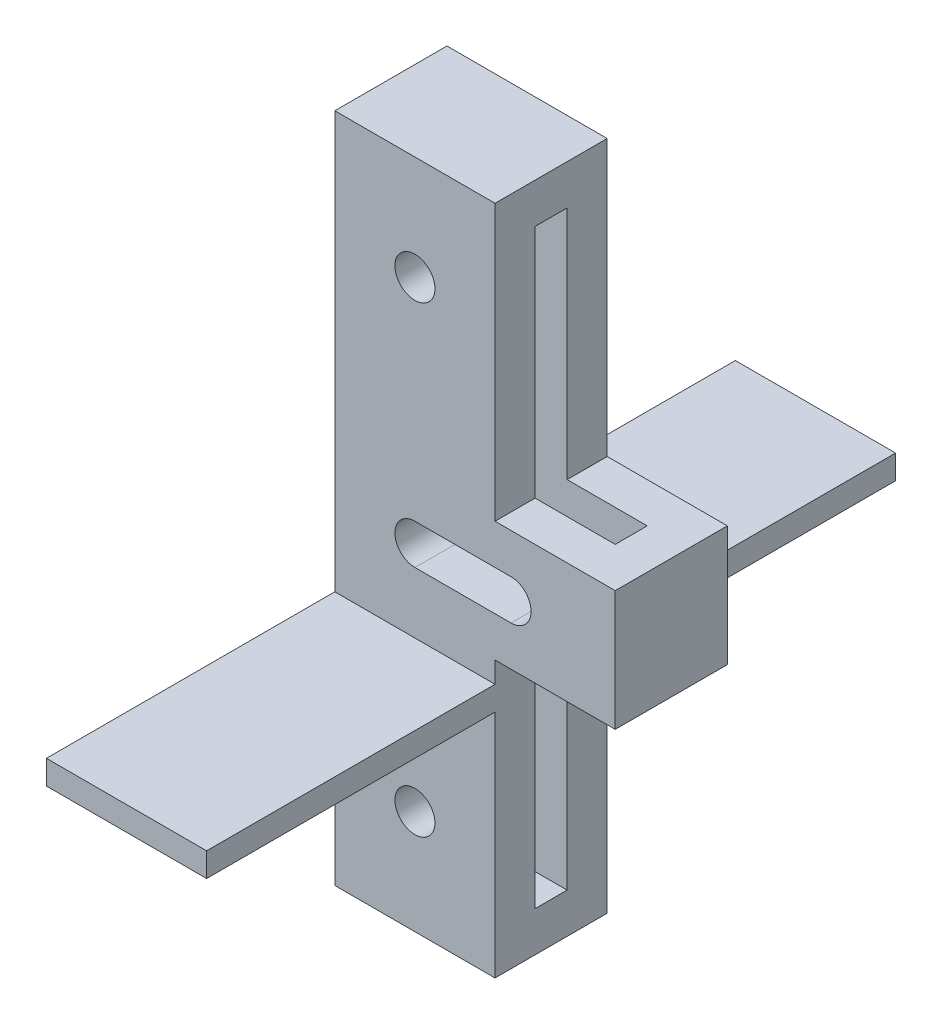
ISO-10303-21;
HEADER;
FILE_DESCRIPTION(('STEP AP214'),'2;1');
FILE_NAME('part.step','',(''),(''),'','','');
FILE_SCHEMA(('AUTOMOTIVE_DESIGN { 1 0 10303 214 1 1 1 1 }'));
ENDSEC;
DATA;
#1=APPLICATION_CONTEXT('core data for automotive mechanical design processes');
#2=APPLICATION_PROTOCOL_DEFINITION('international standard','automotive_design',2000,#1);
#3=PRODUCT_CONTEXT('',#1,'mechanical');
#4=PRODUCT('Part','Part','',(#3));
#5=PRODUCT_RELATED_PRODUCT_CATEGORY('part','',(#4));
#6=PRODUCT_DEFINITION_FORMATION('','',#4);
#7=PRODUCT_DEFINITION_CONTEXT('part definition',#1,'design');
#8=PRODUCT_DEFINITION('design','',#6,#7);
#9=PRODUCT_DEFINITION_SHAPE('','',#8);
#10=(LENGTH_UNIT() NAMED_UNIT(*) SI_UNIT(.MILLI.,.METRE.));
#11=(NAMED_UNIT(*) PLANE_ANGLE_UNIT() SI_UNIT($,.RADIAN.));
#12=(NAMED_UNIT(*) SI_UNIT($,.STERADIAN.) SOLID_ANGLE_UNIT());
#13=UNCERTAINTY_MEASURE_WITH_UNIT(LENGTH_MEASURE(1.E-05),#10,'distance_accuracy_value','');
#14=(GEOMETRIC_REPRESENTATION_CONTEXT(3) GLOBAL_UNCERTAINTY_ASSIGNED_CONTEXT((#13)) GLOBAL_UNIT_ASSIGNED_CONTEXT((#10,
#11,#12)) REPRESENTATION_CONTEXT('',''));
#15=CARTESIAN_POINT('',(0.,0.,0.));
#16=DIRECTION('',(0.,0.,1.));
#17=DIRECTION('',(1.,0.,0.));
#18=AXIS2_PLACEMENT_3D('',#15,#16,#17);
#19=CARTESIAN_POINT('',(-10.,0.,6.99999999999999));
#20=DIRECTION('',(0.,0.,-1.));
#21=DIRECTION('',(-1.,0.,0.));
#22=AXIS2_PLACEMENT_3D('',#19,#20,#21);
#23=PLANE('',#22);
#24=CARTESIAN_POINT('',(0.,-28.875,6.99999999999999));
#25=DIRECTION('',(0.,0.,-1.));
#26=DIRECTION('',(-1.,0.,0.));
#27=AXIS2_PLACEMENT_3D('',#24,#25,#26);
#28=CIRCLE('',#27,2.5);
#29=CARTESIAN_POINT('',(-2.5,-28.875,6.99999999999999));
#30=VERTEX_POINT('',#29);
#31=EDGE_CURVE('E328',#30,#30,#28,.T.);
#32=ORIENTED_EDGE('',*,*,#31,.T.);
#33=EDGE_LOOP('',(#32));
#34=FACE_BOUND('',#33,.T.);
#35=DIRECTION('',(1.,0.,0.));
#36=VECTOR('',#35,1.);
#37=CARTESIAN_POINT('',(-10.,-13.125,6.99999999999999));
#38=LINE('',#37,#36);
#39=CARTESIAN_POINT('',(-10.,-13.125,6.99999999999999));
#40=VERTEX_POINT('',#39);
#41=CARTESIAN_POINT('',(10.,-13.125,6.99999999999999));
#42=VERTEX_POINT('',#41);
#43=EDGE_CURVE('E314',#40,#42,#38,.T.);
#44=ORIENTED_EDGE('',*,*,#43,.F.);
#45=DIRECTION('',(0.,1.,0.));
#46=VECTOR('',#45,1.);
#47=CARTESIAN_POINT('',(-10.,0.,6.99999999999999));
#48=LINE('',#47,#46);
#49=CARTESIAN_POINT('',(-10.,-41.875,6.99999999999999));
#50=VERTEX_POINT('',#49);
#51=EDGE_CURVE('E678',#50,#40,#48,.T.);
#52=ORIENTED_EDGE('',*,*,#51,.F.);
#53=DIRECTION('',(1.,0.,0.));
#54=VECTOR('',#53,1.);
#55=CARTESIAN_POINT('',(-10.,-41.875,6.99999999999999));
#56=LINE('',#55,#54);
#57=CARTESIAN_POINT('',(10.,-41.875,6.99999999999999));
#58=VERTEX_POINT('',#57);
#59=EDGE_CURVE('E706',#50,#58,#56,.T.);
#60=ORIENTED_EDGE('',*,*,#59,.T.);
#61=DIRECTION('',(0.,1.,0.));
#62=VECTOR('',#61,1.);
#63=CARTESIAN_POINT('',(10.,0.,6.99999999999999));
#64=LINE('',#63,#62);
#65=EDGE_CURVE('E662',#58,#42,#64,.T.);
#66=ORIENTED_EDGE('',*,*,#65,.T.);
#67=EDGE_LOOP('',(#44,#52,#60,#66));
#68=FACE_BOUND('',#67,.T.);
#69=ADVANCED_FACE('F39',(#34,#68),#23,.F.);
#70=CARTESIAN_POINT('',(-10.,0.,-7.));
#71=DIRECTION('',(0.,0.,-1.));
#72=DIRECTION('',(0.,1.,0.));
#73=AXIS2_PLACEMENT_3D('',#70,#71,#72);
#74=PLANE('',#73);
#75=CARTESIAN_POINT('',(0.,-28.875,-7.00000000000001));
#76=DIRECTION('',(0.,0.,-1.));
#77=DIRECTION('',(0.,1.,0.));
#78=AXIS2_PLACEMENT_3D('',#75,#76,#77);
#79=CIRCLE('',#78,2.5);
#80=CARTESIAN_POINT('',(0.,-26.375,-7.00000000000001));
#81=VERTEX_POINT('',#80);
#82=EDGE_CURVE('E335',#81,#81,#79,.T.);
#83=ORIENTED_EDGE('',*,*,#82,.F.);
#84=EDGE_LOOP('',(#83));
#85=FACE_BOUND('',#84,.T.);
#86=DIRECTION('',(0.,1.,0.));
#87=VECTOR('',#86,1.);
#88=CARTESIAN_POINT('',(-10.,0.,-7.));
#89=LINE('',#88,#87);
#90=CARTESIAN_POINT('',(-10.,-41.875,-7.00000000000001));
#91=VERTEX_POINT('',#90);
#92=CARTESIAN_POINT('',(-10.,-13.125,-7.));
#93=VERTEX_POINT('',#92);
#94=EDGE_CURVE('E571',#91,#93,#89,.T.);
#95=ORIENTED_EDGE('',*,*,#94,.T.);
#96=DIRECTION('',(1.,0.,0.));
#97=VECTOR('',#96,1.);
#98=CARTESIAN_POINT('',(-10.,-13.125,-7.));
#99=LINE('',#98,#97);
#100=CARTESIAN_POINT('',(10.,-13.125,-7.));
#101=VERTEX_POINT('',#100);
#102=EDGE_CURVE('E575',#93,#101,#99,.T.);
#103=ORIENTED_EDGE('',*,*,#102,.T.);
#104=DIRECTION('',(0.,1.,0.));
#105=VECTOR('',#104,1.);
#106=CARTESIAN_POINT('',(10.,0.,-7.));
#107=LINE('',#106,#105);
#108=CARTESIAN_POINT('',(10.,-41.875,-7.00000000000001));
#109=VERTEX_POINT('',#108);
#110=EDGE_CURVE('E692',#109,#101,#107,.T.);
#111=ORIENTED_EDGE('',*,*,#110,.F.);
#112=DIRECTION('',(1.,0.,0.));
#113=VECTOR('',#112,1.);
#114=CARTESIAN_POINT('',(-10.,-41.875,-7.00000000000001));
#115=LINE('',#114,#113);
#116=EDGE_CURVE('E577',#91,#109,#115,.T.);
#117=ORIENTED_EDGE('',*,*,#116,.F.);
#118=EDGE_LOOP('',(#95,#103,#111,#117));
#119=FACE_BOUND('',#118,.T.);
#120=ADVANCED_FACE('F391',(#85,#119),#74,.T.);
#121=CARTESIAN_POINT('',(-10.,0.,1.99999999999999));
#122=DIRECTION('',(0.,0.,1.));
#123=DIRECTION('',(0.,-1.,0.));
#124=AXIS2_PLACEMENT_3D('',#121,#122,#123);
#125=PLANE('',#124);
#126=CARTESIAN_POINT('',(0.,-28.875,1.99999999999998));
#127=DIRECTION('',(0.,0.,1.));
#128=DIRECTION('',(0.,-1.,0.));
#129=AXIS2_PLACEMENT_3D('',#126,#127,#128);
#130=CIRCLE('',#129,2.5);
#131=CARTESIAN_POINT('',(0.,-31.375,1.99999999999998));
#132=VERTEX_POINT('',#131);
#133=EDGE_CURVE('E340',#132,#132,#130,.T.);
#134=ORIENTED_EDGE('',*,*,#133,.T.);
#135=EDGE_LOOP('',(#134));
#136=FACE_BOUND('',#135,.T.);
#137=CARTESIAN_POINT('',(0.,28.875,1.99999999999999));
#138=DIRECTION('',(0.,0.,1.));
#139=DIRECTION('',(0.,-1.,0.));
#140=AXIS2_PLACEMENT_3D('',#137,#138,#139);
#141=CIRCLE('',#140,2.5);
#142=CARTESIAN_POINT('',(0.,26.375,1.99999999999999));
#143=VERTEX_POINT('',#142);
#144=EDGE_CURVE('E346',#143,#143,#141,.T.);
#145=ORIENTED_EDGE('',*,*,#144,.T.);
#146=EDGE_LOOP('',(#145));
#147=FACE_BOUND('',#146,.T.);
#148=DIRECTION('',(-1.,0.,0.));
#149=VECTOR('',#148,1.);
#150=CARTESIAN_POINT('',(-10.,2.5,1.99999999999999));
#151=LINE('',#150,#149);
#152=CARTESIAN_POINT('',(12.,2.5,1.99999999999999));
#153=VERTEX_POINT('',#152);
#154=CARTESIAN_POINT('',(0.,2.5,1.99999999999999));
#155=VERTEX_POINT('',#154);
#156=EDGE_CURVE('E285',#153,#155,#151,.T.);
#157=ORIENTED_EDGE('',*,*,#156,.T.);
#158=CARTESIAN_POINT('',(0.,0.,1.99999999999999));
#159=DIRECTION('',(0.,0.,1.));
#160=DIRECTION('',(0.,-1.,0.));
#161=AXIS2_PLACEMENT_3D('',#158,#159,#160);
#162=CIRCLE('',#161,2.5);
#163=CARTESIAN_POINT('',(0.,-2.5,1.99999999999999));
#164=VERTEX_POINT('',#163);
#165=EDGE_CURVE('E293',#155,#164,#162,.T.);
#166=ORIENTED_EDGE('',*,*,#165,.T.);
#167=DIRECTION('',(1.,0.,0.));
#168=VECTOR('',#167,1.);
#169=CARTESIAN_POINT('',(-10.,-2.5,1.99999999999999));
#170=LINE('',#169,#168);
#171=CARTESIAN_POINT('',(12.,-2.5,1.99999999999999));
#172=VERTEX_POINT('',#171);
#173=EDGE_CURVE('E255',#164,#172,#170,.T.);
#174=ORIENTED_EDGE('',*,*,#173,.T.);
#175=CARTESIAN_POINT('',(12.,0.,1.99999999999999));
#176=DIRECTION('',(0.,0.,1.));
#177=DIRECTION('',(0.,-1.,0.));
#178=AXIS2_PLACEMENT_3D('',#175,#176,#177);
#179=CIRCLE('',#178,2.5);
#180=EDGE_CURVE('E272',#172,#153,#179,.T.);
#181=ORIENTED_EDGE('',*,*,#180,.T.);
#182=EDGE_LOOP('',(#157,#166,#174,#181));
#183=FACE_BOUND('',#182,.T.);
#184=DIRECTION('',(0.,-1.,0.));
#185=VECTOR('',#184,1.);
#186=CARTESIAN_POINT('',(20.,0.,1.99999999999999));
#187=LINE('',#186,#185);
#188=CARTESIAN_POINT('',(20.,7.5,2.));
#189=VERTEX_POINT('',#188);
#190=CARTESIAN_POINT('',(20.,-7.5,1.99999999999999));
#191=VERTEX_POINT('',#190);
#192=EDGE_CURVE('E705',#189,#191,#187,.T.);
#193=ORIENTED_EDGE('',*,*,#192,.T.);
#194=DIRECTION('',(1.,0.,0.));
#195=VECTOR('',#194,1.);
#196=CARTESIAN_POINT('',(-10.,-7.5,1.99999999999999));
#197=LINE('',#196,#195);
#198=CARTESIAN_POINT('',(10.,-7.5,1.99999999999999));
#199=VERTEX_POINT('',#198);
#200=EDGE_CURVE('E748',#199,#191,#197,.T.);
#201=ORIENTED_EDGE('',*,*,#200,.F.);
#202=DIRECTION('',(0.,-1.,0.));
#203=VECTOR('',#202,1.);
#204=CARTESIAN_POINT('',(10.,0.,1.99999999999999));
#205=LINE('',#204,#203);
#206=CARTESIAN_POINT('',(10.,-36.875,1.99999999999999));
#207=VERTEX_POINT('',#206);
#208=EDGE_CURVE('E664',#199,#207,#205,.T.);
#209=ORIENTED_EDGE('',*,*,#208,.T.);
#210=DIRECTION('',(1.,0.,0.));
#211=VECTOR('',#210,1.);
#212=CARTESIAN_POINT('',(-10.,-36.875,1.99999999999999));
#213=LINE('',#212,#211);
#214=CARTESIAN_POINT('',(-10.,-36.875,1.99999999999999));
#215=VERTEX_POINT('',#214);
#216=EDGE_CURVE('E708',#215,#207,#213,.T.);
#217=ORIENTED_EDGE('',*,*,#216,.F.);
#218=DIRECTION('',(0.,-1.,0.));
#219=VECTOR('',#218,1.);
#220=CARTESIAN_POINT('',(-10.,0.,1.99999999999999));
#221=LINE('',#220,#219);
#222=CARTESIAN_POINT('',(-10.,36.875,1.99999999999999));
#223=VERTEX_POINT('',#222);
#224=EDGE_CURVE('E682',#223,#215,#221,.T.);
#225=ORIENTED_EDGE('',*,*,#224,.F.);
#226=DIRECTION('',(1.,0.,0.));
#227=VECTOR('',#226,1.);
#228=CARTESIAN_POINT('',(-10.,36.875,1.99999999999999));
#229=LINE('',#228,#227);
#230=CARTESIAN_POINT('',(10.,36.875,1.99999999999999));
#231=VERTEX_POINT('',#230);
#232=EDGE_CURVE('E323',#223,#231,#229,.T.);
#233=ORIENTED_EDGE('',*,*,#232,.T.);
#234=DIRECTION('',(0.,-1.,0.));
#235=VECTOR('',#234,1.);
#236=CARTESIAN_POINT('',(10.,0.,1.99999999999999));
#237=LINE('',#236,#235);
#238=CARTESIAN_POINT('',(10.,7.5,2.));
#239=VERTEX_POINT('',#238);
#240=EDGE_CURVE('E771',#231,#239,#237,.T.);
#241=ORIENTED_EDGE('',*,*,#240,.T.);
#242=DIRECTION('',(1.,0.,0.));
#243=VECTOR('',#242,1.);
#244=CARTESIAN_POINT('',(-10.,7.5,2.));
#245=LINE('',#244,#243);
#246=EDGE_CURVE('E746',#239,#189,#245,.T.);
#247=ORIENTED_EDGE('',*,*,#246,.T.);
#248=EDGE_LOOP('',(#193,#201,#209,#217,#225,#233,#241,#247));
#249=FACE_BOUND('',#248,.T.);
#250=ADVANCED_FACE('F361',(#136,#147,#183,#249),#125,.F.);
#251=CARTESIAN_POINT('',(-10.,0.,-2.00000000000001));
#252=DIRECTION('',(0.,0.,1.));
#253=DIRECTION('',(0.,-1.,0.));
#254=AXIS2_PLACEMENT_3D('',#251,#252,#253);
#255=PLANE('',#254);
#256=CARTESIAN_POINT('',(0.,-28.875,-2.00000000000001));
#257=DIRECTION('',(0.,0.,1.));
#258=DIRECTION('',(0.,-1.,0.));
#259=AXIS2_PLACEMENT_3D('',#256,#257,#258);
#260=CIRCLE('',#259,2.5);
#261=CARTESIAN_POINT('',(0.,-31.375,-2.00000000000001));
#262=VERTEX_POINT('',#261);
#263=EDGE_CURVE('E43',#262,#262,#260,.T.);
#264=ORIENTED_EDGE('',*,*,#263,.F.);
#265=EDGE_LOOP('',(#264));
#266=FACE_BOUND('',#265,.T.);
#267=CARTESIAN_POINT('',(0.,28.875,-2.00000000000001));
#268=DIRECTION('',(0.,0.,1.));
#269=DIRECTION('',(0.,-1.,0.));
#270=AXIS2_PLACEMENT_3D('',#267,#268,#269);
#271=CIRCLE('',#270,2.5);
#272=CARTESIAN_POINT('',(0.,26.375,-2.00000000000001));
#273=VERTEX_POINT('',#272);
#274=EDGE_CURVE('E332',#273,#273,#271,.T.);
#275=ORIENTED_EDGE('',*,*,#274,.F.);
#276=EDGE_LOOP('',(#275));
#277=FACE_BOUND('',#276,.T.);
#278=CARTESIAN_POINT('',(0.,0.,-2.00000000000001));
#279=DIRECTION('',(0.,0.,1.));
#280=DIRECTION('',(0.,-1.,0.));
#281=AXIS2_PLACEMENT_3D('',#278,#279,#280);
#282=CIRCLE('',#281,2.5);
#283=CARTESIAN_POINT('',(0.,2.5,-2.00000000000001));
#284=VERTEX_POINT('',#283);
#285=CARTESIAN_POINT('',(0.,-2.5,-2.00000000000001));
#286=VERTEX_POINT('',#285);
#287=EDGE_CURVE('E291',#284,#286,#282,.T.);
#288=ORIENTED_EDGE('',*,*,#287,.F.);
#289=DIRECTION('',(-1.,0.,0.));
#290=VECTOR('',#289,1.);
#291=CARTESIAN_POINT('',(-10.,2.5,-2.00000000000001));
#292=LINE('',#291,#290);
#293=CARTESIAN_POINT('',(12.,2.5,-2.00000000000001));
#294=VERTEX_POINT('',#293);
#295=EDGE_CURVE('E271',#294,#284,#292,.T.);
#296=ORIENTED_EDGE('',*,*,#295,.F.);
#297=CARTESIAN_POINT('',(12.,0.,-2.00000000000001));
#298=DIRECTION('',(0.,0.,1.));
#299=DIRECTION('',(0.,-1.,0.));
#300=AXIS2_PLACEMENT_3D('',#297,#298,#299);
#301=CIRCLE('',#300,2.5);
#302=CARTESIAN_POINT('',(12.,-2.5,-2.00000000000001));
#303=VERTEX_POINT('',#302);
#304=EDGE_CURVE('E261',#303,#294,#301,.T.);
#305=ORIENTED_EDGE('',*,*,#304,.F.);
#306=DIRECTION('',(1.,0.,0.));
#307=VECTOR('',#306,1.);
#308=CARTESIAN_POINT('',(-10.,-2.5,-2.00000000000001));
#309=LINE('',#308,#307);
#310=EDGE_CURVE('E247',#286,#303,#309,.T.);
#311=ORIENTED_EDGE('',*,*,#310,.F.);
#312=EDGE_LOOP('',(#288,#296,#305,#311));
#313=FACE_BOUND('',#312,.T.);
#314=DIRECTION('',(0.,-1.,0.));
#315=VECTOR('',#314,1.);
#316=CARTESIAN_POINT('',(-10.,0.,-2.00000000000001));
#317=LINE('',#316,#315);
#318=CARTESIAN_POINT('',(-10.,36.875,-2.00000000000001));
#319=VERTEX_POINT('',#318);
#320=CARTESIAN_POINT('',(-10.,-36.875,-2.00000000000001));
#321=VERTEX_POINT('',#320);
#322=EDGE_CURVE('E777',#319,#321,#317,.T.);
#323=ORIENTED_EDGE('',*,*,#322,.T.);
#324=DIRECTION('',(1.,0.,0.));
#325=VECTOR('',#324,1.);
#326=CARTESIAN_POINT('',(-10.,-36.875,-2.00000000000001));
#327=LINE('',#326,#325);
#328=CARTESIAN_POINT('',(10.,-36.875,-2.00000000000001));
#329=VERTEX_POINT('',#328);
#330=EDGE_CURVE('E703',#321,#329,#327,.T.);
#331=ORIENTED_EDGE('',*,*,#330,.T.);
#332=DIRECTION('',(0.,-1.,0.));
#333=VECTOR('',#332,1.);
#334=CARTESIAN_POINT('',(10.,0.,-2.00000000000001));
#335=LINE('',#334,#333);
#336=CARTESIAN_POINT('',(10.,-7.5,-2.00000000000001));
#337=VERTEX_POINT('',#336);
#338=EDGE_CURVE('E815',#337,#329,#335,.T.);
#339=ORIENTED_EDGE('',*,*,#338,.F.);
#340=DIRECTION('',(1.,0.,0.));
#341=VECTOR('',#340,1.);
#342=CARTESIAN_POINT('',(-10.,-7.5,-2.00000000000001));
#343=LINE('',#342,#341);
#344=CARTESIAN_POINT('',(20.,-7.5,-2.00000000000001));
#345=VERTEX_POINT('',#344);
#346=EDGE_CURVE('E724',#337,#345,#343,.T.);
#347=ORIENTED_EDGE('',*,*,#346,.T.);
#348=DIRECTION('',(0.,-1.,0.));
#349=VECTOR('',#348,1.);
#350=CARTESIAN_POINT('',(20.,0.,-2.00000000000001));
#351=LINE('',#350,#349);
#352=CARTESIAN_POINT('',(20.,7.5,-2.));
#353=VERTEX_POINT('',#352);
#354=EDGE_CURVE('E716',#353,#345,#351,.T.);
#355=ORIENTED_EDGE('',*,*,#354,.F.);
#356=DIRECTION('',(1.,0.,0.));
#357=VECTOR('',#356,1.);
#358=CARTESIAN_POINT('',(-10.,7.5,-2.));
#359=LINE('',#358,#357);
#360=CARTESIAN_POINT('',(10.,7.5,-2.));
#361=VERTEX_POINT('',#360);
#362=EDGE_CURVE('E725',#361,#353,#359,.T.);
#363=ORIENTED_EDGE('',*,*,#362,.F.);
#364=DIRECTION('',(0.,-1.,0.));
#365=VECTOR('',#364,1.);
#366=CARTESIAN_POINT('',(10.,0.,-2.00000000000001));
#367=LINE('',#366,#365);
#368=CARTESIAN_POINT('',(10.,36.875,-2.00000000000001));
#369=VERTEX_POINT('',#368);
#370=EDGE_CURVE('E753',#369,#361,#367,.T.);
#371=ORIENTED_EDGE('',*,*,#370,.F.);
#372=DIRECTION('',(1.,0.,0.));
#373=VECTOR('',#372,1.);
#374=CARTESIAN_POINT('',(-10.,36.875,-2.00000000000001));
#375=LINE('',#374,#373);
#376=EDGE_CURVE('E685',#319,#369,#375,.T.);
#377=ORIENTED_EDGE('',*,*,#376,.F.);
#378=EDGE_LOOP('',(#323,#331,#339,#347,#355,#363,#371,#377));
#379=FACE_BOUND('',#378,.T.);
#380=ADVANCED_FACE('F269',(#266,#277,#313,#379),#255,.T.);
#381=CARTESIAN_POINT('',(-10.,36.875,0.));
#382=DIRECTION('',(0.,-1.,0.));
#383=DIRECTION('',(0.,0.,-1.));
#384=AXIS2_PLACEMENT_3D('',#381,#382,#383);
#385=PLANE('',#384);
#386=ORIENTED_EDGE('',*,*,#376,.T.);
#387=DIRECTION('',(0.,0.,-1.));
#388=VECTOR('',#387,1.);
#389=CARTESIAN_POINT('',(10.,36.875,0.));
#390=LINE('',#389,#388);
#391=EDGE_CURVE('E745',#231,#369,#390,.T.);
#392=ORIENTED_EDGE('',*,*,#391,.F.);
#393=ORIENTED_EDGE('',*,*,#232,.F.);
#394=DIRECTION('',(0.,0.,-1.));
#395=VECTOR('',#394,1.);
#396=CARTESIAN_POINT('',(-10.,36.875,0.));
#397=LINE('',#396,#395);
#398=EDGE_CURVE('E774',#223,#319,#397,.T.);
#399=ORIENTED_EDGE('',*,*,#398,.T.);
#400=EDGE_LOOP('',(#386,#392,#393,#399));
#401=FACE_BOUND('',#400,.T.);
#402=ADVANCED_FACE('F41',(#401),#385,.T.);
#403=CARTESIAN_POINT('',(0.,28.875,6.99999999999999));
#404=DIRECTION('',(0.,0.,-1.));
#405=DIRECTION('',(-1.,0.,0.));
#406=AXIS2_PLACEMENT_3D('',#403,#404,#405);
#407=CIRCLE('',#406,2.5);
#408=CARTESIAN_POINT('',(-2.5,28.875,6.99999999999999));
#409=VERTEX_POINT('',#408);
#410=EDGE_CURVE('E327',#409,#409,#407,.T.);
#411=ORIENTED_EDGE('',*,*,#410,.T.);
#412=EDGE_LOOP('',(#411));
#413=FACE_BOUND('',#412,.T.);
#414=DIRECTION('',(-1.,0.,0.));
#415=VECTOR('',#414,1.);
#416=CARTESIAN_POINT('',(-10.,-2.5,6.99999999999999));
#417=LINE('',#416,#415);
#418=CARTESIAN_POINT('',(12.,-2.5,6.99999999999999));
#419=VERTEX_POINT('',#418);
#420=CARTESIAN_POINT('',(0.,-2.5,6.99999999999999));
#421=VERTEX_POINT('',#420);
#422=EDGE_CURVE('E256',#419,#421,#417,.T.);
#423=ORIENTED_EDGE('',*,*,#422,.T.);
#424=CARTESIAN_POINT('',(0.,0.,6.99999999999999));
#425=DIRECTION('',(0.,0.,-1.));
#426=DIRECTION('',(-1.,0.,0.));
#427=AXIS2_PLACEMENT_3D('',#424,#425,#426);
#428=CIRCLE('',#427,2.5);
#429=CARTESIAN_POINT('',(0.,2.5,6.99999999999999));
#430=VERTEX_POINT('',#429);
#431=EDGE_CURVE('E288',#421,#430,#428,.T.);
#432=ORIENTED_EDGE('',*,*,#431,.T.);
#433=DIRECTION('',(1.,0.,0.));
#434=VECTOR('',#433,1.);
#435=CARTESIAN_POINT('',(-10.,2.5,6.99999999999999));
#436=LINE('',#435,#434);
#437=CARTESIAN_POINT('',(12.,2.5,6.99999999999999));
#438=VERTEX_POINT('',#437);
#439=EDGE_CURVE('E276',#430,#438,#436,.T.);
#440=ORIENTED_EDGE('',*,*,#439,.T.);
#441=CARTESIAN_POINT('',(12.,0.,6.99999999999999));
#442=DIRECTION('',(0.,0.,-1.));
#443=DIRECTION('',(-1.,0.,0.));
#444=AXIS2_PLACEMENT_3D('',#441,#442,#443);
#445=CIRCLE('',#444,2.5);
#446=EDGE_CURVE('E273',#438,#419,#445,.T.);
#447=ORIENTED_EDGE('',*,*,#446,.T.);
#448=EDGE_LOOP('',(#423,#432,#440,#447));
#449=FACE_BOUND('',#448,.T.);
#450=CARTESIAN_POINT('',(-10.,-10.125,6.99999999999999));
#451=VERTEX_POINT('',#450);
#452=CARTESIAN_POINT('',(-10.,41.875,6.99999999999999));
#453=VERTEX_POINT('',#452);
#454=EDGE_CURVE('E650',#451,#453,#48,.T.);
#455=ORIENTED_EDGE('',*,*,#454,.F.);
#456=DIRECTION('',(1.,0.,0.));
#457=VECTOR('',#456,1.);
#458=CARTESIAN_POINT('',(-10.,-10.125,6.99999999999999));
#459=LINE('',#458,#457);
#460=CARTESIAN_POINT('',(10.,-10.125,6.99999999999999));
#461=VERTEX_POINT('',#460);
#462=EDGE_CURVE('E310',#451,#461,#459,.T.);
#463=ORIENTED_EDGE('',*,*,#462,.T.);
#464=CARTESIAN_POINT('',(10.,-7.5,6.99999999999999));
#465=VERTEX_POINT('',#464);
#466=EDGE_CURVE('E638',#461,#465,#64,.T.);
#467=ORIENTED_EDGE('',*,*,#466,.T.);
#468=DIRECTION('',(1.,0.,0.));
#469=VECTOR('',#468,1.);
#470=CARTESIAN_POINT('',(-10.,-7.5,6.99999999999999));
#471=LINE('',#470,#469);
#472=CARTESIAN_POINT('',(25.,-7.5,6.99999999999999));
#473=VERTEX_POINT('',#472);
#474=EDGE_CURVE('E742',#465,#473,#471,.T.);
#475=ORIENTED_EDGE('',*,*,#474,.T.);
#476=DIRECTION('',(0.,1.,0.));
#477=VECTOR('',#476,1.);
#478=CARTESIAN_POINT('',(25.,0.,6.99999999999999));
#479=LINE('',#478,#477);
#480=CARTESIAN_POINT('',(25.,7.5,7.));
#481=VERTEX_POINT('',#480);
#482=EDGE_CURVE('E728',#473,#481,#479,.T.);
#483=ORIENTED_EDGE('',*,*,#482,.T.);
#484=DIRECTION('',(1.,0.,0.));
#485=VECTOR('',#484,1.);
#486=CARTESIAN_POINT('',(-10.,7.5,7.));
#487=LINE('',#486,#485);
#488=CARTESIAN_POINT('',(10.,7.5,7.));
#489=VERTEX_POINT('',#488);
#490=EDGE_CURVE('E743',#489,#481,#487,.T.);
#491=ORIENTED_EDGE('',*,*,#490,.F.);
#492=DIRECTION('',(0.,1.,0.));
#493=VECTOR('',#492,1.);
#494=CARTESIAN_POINT('',(10.,0.,6.99999999999999));
#495=LINE('',#494,#493);
#496=CARTESIAN_POINT('',(10.,41.875,6.99999999999999));
#497=VERTEX_POINT('',#496);
#498=EDGE_CURVE('E765',#489,#497,#495,.T.);
#499=ORIENTED_EDGE('',*,*,#498,.T.);
#500=DIRECTION('',(1.,0.,0.));
#501=VECTOR('',#500,1.);
#502=CARTESIAN_POINT('',(-10.,41.875,6.99999999999999));
#503=LINE('',#502,#501);
#504=EDGE_CURVE('E687',#453,#497,#503,.T.);
#505=ORIENTED_EDGE('',*,*,#504,.F.);
#506=EDGE_LOOP('',(#455,#463,#467,#475,#483,#491,#499,#505));
#507=FACE_BOUND('',#506,.T.);
#508=ADVANCED_FACE('F370',(#413,#449,#507),#23,.F.);
#509=CARTESIAN_POINT('',(-10.,41.875,0.));
#510=DIRECTION('',(0.,-1.,0.));
#511=DIRECTION('',(0.,0.,-1.));
#512=AXIS2_PLACEMENT_3D('',#509,#510,#511);
#513=PLANE('',#512);
#514=ORIENTED_EDGE('',*,*,#504,.T.);
#515=DIRECTION('',(0.,0.,-1.));
#516=VECTOR('',#515,1.);
#517=CARTESIAN_POINT('',(10.,41.875,0.));
#518=LINE('',#517,#516);
#519=CARTESIAN_POINT('',(10.,41.875,-6.99999999999999));
#520=VERTEX_POINT('',#519);
#521=EDGE_CURVE('E762',#497,#520,#518,.T.);
#522=ORIENTED_EDGE('',*,*,#521,.T.);
#523=DIRECTION('',(1.,0.,0.));
#524=VECTOR('',#523,1.);
#525=CARTESIAN_POINT('',(-10.,41.875,-6.99999999999999));
#526=LINE('',#525,#524);
#527=CARTESIAN_POINT('',(-10.,41.875,-6.99999999999999));
#528=VERTEX_POINT('',#527);
#529=EDGE_CURVE('E689',#528,#520,#526,.T.);
#530=ORIENTED_EDGE('',*,*,#529,.F.);
#531=DIRECTION('',(0.,0.,-1.));
#532=VECTOR('',#531,1.);
#533=CARTESIAN_POINT('',(-10.,41.875,0.));
#534=LINE('',#533,#532);
#535=EDGE_CURVE('E580',#453,#528,#534,.T.);
#536=ORIENTED_EDGE('',*,*,#535,.F.);
#537=EDGE_LOOP('',(#514,#522,#530,#536));
#538=FACE_BOUND('',#537,.T.);
#539=ADVANCED_FACE('F403',(#538),#513,.F.);
#540=CARTESIAN_POINT('',(0.,28.875,-6.99999999999999));
#541=DIRECTION('',(0.,0.,-1.));
#542=DIRECTION('',(0.,1.,0.));
#543=AXIS2_PLACEMENT_3D('',#540,#541,#542);
#544=CIRCLE('',#543,2.5);
#545=CARTESIAN_POINT('',(0.,31.375,-6.99999999999999));
#546=VERTEX_POINT('',#545);
#547=EDGE_CURVE('E325',#546,#546,#544,.T.);
#548=ORIENTED_EDGE('',*,*,#547,.F.);
#549=EDGE_LOOP('',(#548));
#550=FACE_BOUND('',#549,.T.);
#551=CARTESIAN_POINT('',(0.,0.,-7.));
#552=DIRECTION('',(0.,0.,-1.));
#553=DIRECTION('',(0.,1.,0.));
#554=AXIS2_PLACEMENT_3D('',#551,#552,#553);
#555=CIRCLE('',#554,2.5);
#556=CARTESIAN_POINT('',(0.,-2.5,-7.));
#557=VERTEX_POINT('',#556);
#558=CARTESIAN_POINT('',(0.,2.5,-7.));
#559=VERTEX_POINT('',#558);
#560=EDGE_CURVE('E11',#557,#559,#555,.T.);
#561=ORIENTED_EDGE('',*,*,#560,.F.);
#562=DIRECTION('',(-1.,0.,0.));
#563=VECTOR('',#562,1.);
#564=CARTESIAN_POINT('',(-10.,-2.5,-7.));
#565=LINE('',#564,#563);
#566=CARTESIAN_POINT('',(12.,-2.5,-7.));
#567=VERTEX_POINT('',#566);
#568=EDGE_CURVE('E321',#567,#557,#565,.T.);
#569=ORIENTED_EDGE('',*,*,#568,.F.);
#570=CARTESIAN_POINT('',(12.,0.,-7.));
#571=DIRECTION('',(0.,0.,-1.));
#572=DIRECTION('',(0.,1.,0.));
#573=AXIS2_PLACEMENT_3D('',#570,#571,#572);
#574=CIRCLE('',#573,2.5);
#575=CARTESIAN_POINT('',(12.,2.5,-7.));
#576=VERTEX_POINT('',#575);
#577=EDGE_CURVE('E264',#576,#567,#574,.T.);
#578=ORIENTED_EDGE('',*,*,#577,.F.);
#579=DIRECTION('',(1.,0.,0.));
#580=VECTOR('',#579,1.);
#581=CARTESIAN_POINT('',(-10.,2.5,-7.));
#582=LINE('',#581,#580);
#583=EDGE_CURVE('E48',#559,#576,#582,.T.);
#584=ORIENTED_EDGE('',*,*,#583,.F.);
#585=EDGE_LOOP('',(#561,#569,#578,#584));
#586=FACE_BOUND('',#585,.T.);
#587=DIRECTION('',(1.,0.,0.));
#588=VECTOR('',#587,1.);
#589=CARTESIAN_POINT('',(-10.,-10.125,-7.));
#590=LINE('',#589,#588);
#591=CARTESIAN_POINT('',(-10.,-10.125,-7.));
#592=VERTEX_POINT('',#591);
#593=CARTESIAN_POINT('',(10.,-10.125,-7.));
#594=VERTEX_POINT('',#593);
#595=EDGE_CURVE('E597',#592,#594,#590,.T.);
#596=ORIENTED_EDGE('',*,*,#595,.F.);
#597=EDGE_CURVE('E581',#592,#528,#89,.T.);
#598=ORIENTED_EDGE('',*,*,#597,.T.);
#599=ORIENTED_EDGE('',*,*,#529,.T.);
#600=DIRECTION('',(0.,1.,0.));
#601=VECTOR('',#600,1.);
#602=CARTESIAN_POINT('',(10.,0.,-7.));
#603=LINE('',#602,#601);
#604=CARTESIAN_POINT('',(10.,7.5,-7.));
#605=VERTEX_POINT('',#604);
#606=EDGE_CURVE('E759',#605,#520,#603,.T.);
#607=ORIENTED_EDGE('',*,*,#606,.F.);
#608=DIRECTION('',(1.,0.,0.));
#609=VECTOR('',#608,1.);
#610=CARTESIAN_POINT('',(-10.,7.5,-7.));
#611=LINE('',#610,#609);
#612=CARTESIAN_POINT('',(25.,7.5,-7.));
#613=VERTEX_POINT('',#612);
#614=EDGE_CURVE('E729',#605,#613,#611,.T.);
#615=ORIENTED_EDGE('',*,*,#614,.T.);
#616=DIRECTION('',(0.,1.,0.));
#617=VECTOR('',#616,1.);
#618=CARTESIAN_POINT('',(25.,0.,-7.));
#619=LINE('',#618,#617);
#620=CARTESIAN_POINT('',(25.,-7.5,-7.));
#621=VERTEX_POINT('',#620);
#622=EDGE_CURVE('E721',#621,#613,#619,.T.);
#623=ORIENTED_EDGE('',*,*,#622,.F.);
#624=DIRECTION('',(1.,0.,0.));
#625=VECTOR('',#624,1.);
#626=CARTESIAN_POINT('',(-10.,-7.5,-7.));
#627=LINE('',#626,#625);
#628=CARTESIAN_POINT('',(10.,-7.5,-7.));
#629=VERTEX_POINT('',#628);
#630=EDGE_CURVE('E732',#629,#621,#627,.T.);
#631=ORIENTED_EDGE('',*,*,#630,.F.);
#632=EDGE_CURVE('E695',#594,#629,#107,.T.);
#633=ORIENTED_EDGE('',*,*,#632,.F.);
#634=EDGE_LOOP('',(#596,#598,#599,#607,#615,#623,#631,#633));
#635=FACE_BOUND('',#634,.T.);
#636=ADVANCED_FACE('F398',(#550,#586,#635),#74,.T.);
#637=CARTESIAN_POINT('',(-10.,0.,0.));
#638=DIRECTION('',(1.,0.,0.));
#639=DIRECTION('',(0.,0.,-1.));
#640=AXIS2_PLACEMENT_3D('',#637,#638,#639);
#641=PLANE('',#640);
#642=ORIENTED_EDGE('',*,*,#94,.F.);
#643=DIRECTION('',(0.,0.,-1.));
#644=VECTOR('',#643,1.);
#645=CARTESIAN_POINT('',(-10.,-41.875,0.));
#646=LINE('',#645,#644);
#647=EDGE_CURVE('E701',#50,#91,#646,.T.);
#648=ORIENTED_EDGE('',*,*,#647,.F.);
#649=ORIENTED_EDGE('',*,*,#51,.T.);
#650=DIRECTION('',(0.,0.,-1.));
#651=VECTOR('',#650,1.);
#652=CARTESIAN_POINT('',(-10.,-13.125,0.));
#653=LINE('',#652,#651);
#654=CARTESIAN_POINT('',(-10.,-13.125,43.));
#655=VERTEX_POINT('',#654);
#656=EDGE_CURVE('E303',#655,#40,#653,.T.);
#657=ORIENTED_EDGE('',*,*,#656,.F.);
#658=DIRECTION('',(0.,1.,0.));
#659=VECTOR('',#658,1.);
#660=CARTESIAN_POINT('',(-10.,0.,43.));
#661=LINE('',#660,#659);
#662=CARTESIAN_POINT('',(-10.,-10.125,43.));
#663=VERTEX_POINT('',#662);
#664=EDGE_CURVE('E301',#655,#663,#661,.T.);
#665=ORIENTED_EDGE('',*,*,#664,.T.);
#666=DIRECTION('',(0.,0.,-1.));
#667=VECTOR('',#666,1.);
#668=CARTESIAN_POINT('',(-10.,-10.125,0.));
#669=LINE('',#668,#667);
#670=EDGE_CURVE('E304',#663,#451,#669,.T.);
#671=ORIENTED_EDGE('',*,*,#670,.T.);
#672=ORIENTED_EDGE('',*,*,#454,.T.);
#673=ORIENTED_EDGE('',*,*,#535,.T.);
#674=ORIENTED_EDGE('',*,*,#597,.F.);
#675=DIRECTION('',(0.,0.,1.));
#676=VECTOR('',#675,1.);
#677=CARTESIAN_POINT('',(-10.,-10.125,0.));
#678=LINE('',#677,#676);
#679=CARTESIAN_POINT('',(-10.,-10.125,-43.));
#680=VERTEX_POINT('',#679);
#681=EDGE_CURVE('E591',#680,#592,#678,.T.);
#682=ORIENTED_EDGE('',*,*,#681,.F.);
#683=DIRECTION('',(0.,1.,0.));
#684=VECTOR('',#683,1.);
#685=CARTESIAN_POINT('',(-10.,1.98914958578674E-13,-43.));
#686=LINE('',#685,#684);
#687=CARTESIAN_POINT('',(-10.,-13.125,-43.));
#688=VERTEX_POINT('',#687);
#689=EDGE_CURVE('E589',#688,#680,#686,.T.);
#690=ORIENTED_EDGE('',*,*,#689,.F.);
#691=DIRECTION('',(0.,0.,1.));
#692=VECTOR('',#691,1.);
#693=CARTESIAN_POINT('',(-10.,-13.125,0.));
#694=LINE('',#693,#692);
#695=EDGE_CURVE('E585',#688,#93,#694,.T.);
#696=ORIENTED_EDGE('',*,*,#695,.T.);
#697=EDGE_LOOP('',(#642,#648,#649,#657,#665,#671,#672,#673,#674,#682,#690,#696));
#698=FACE_BOUND('',#697,.T.);
#699=ORIENTED_EDGE('',*,*,#398,.F.);
#700=ORIENTED_EDGE('',*,*,#224,.T.);
#701=DIRECTION('',(0.,0.,-1.));
#702=VECTOR('',#701,1.);
#703=CARTESIAN_POINT('',(-10.,-36.875,0.));
#704=LINE('',#703,#702);
#705=EDGE_CURVE('E694',#215,#321,#704,.T.);
#706=ORIENTED_EDGE('',*,*,#705,.T.);
#707=ORIENTED_EDGE('',*,*,#322,.F.);
#708=EDGE_LOOP('',(#699,#700,#706,#707));
#709=FACE_BOUND('',#708,.T.);
#710=ADVANCED_FACE('F428',(#698,#709),#641,.F.);
#711=CARTESIAN_POINT('',(10.,0.,0.));
#712=DIRECTION('',(1.,0.,0.));
#713=DIRECTION('',(0.,0.,-1.));
#714=AXIS2_PLACEMENT_3D('',#711,#712,#713);
#715=PLANE('',#714);
#716=ORIENTED_EDGE('',*,*,#391,.T.);
#717=ORIENTED_EDGE('',*,*,#370,.T.);
#718=DIRECTION('',(0.,0.,-1.));
#719=VECTOR('',#718,1.);
#720=CARTESIAN_POINT('',(10.,7.5,0.));
#721=LINE('',#720,#719);
#722=EDGE_CURVE('E756',#361,#605,#721,.T.);
#723=ORIENTED_EDGE('',*,*,#722,.T.);
#724=ORIENTED_EDGE('',*,*,#606,.T.);
#725=ORIENTED_EDGE('',*,*,#521,.F.);
#726=ORIENTED_EDGE('',*,*,#498,.F.);
#727=DIRECTION('',(0.,0.,-1.));
#728=VECTOR('',#727,1.);
#729=CARTESIAN_POINT('',(10.,7.5,0.));
#730=LINE('',#729,#728);
#731=EDGE_CURVE('E768',#489,#239,#730,.T.);
#732=ORIENTED_EDGE('',*,*,#731,.T.);
#733=ORIENTED_EDGE('',*,*,#240,.F.);
#734=EDGE_LOOP('',(#716,#717,#723,#724,#725,#726,#732,#733));
#735=FACE_BOUND('',#734,.T.);
#736=ADVANCED_FACE('F431',(#735),#715,.T.);
#737=CARTESIAN_POINT('',(-10.,7.5,0.));
#738=DIRECTION('',(0.,-1.,0.));
#739=DIRECTION('',(0.,0.,-1.));
#740=AXIS2_PLACEMENT_3D('',#737,#738,#739);
#741=PLANE('',#740);
#742=ORIENTED_EDGE('',*,*,#731,.F.);
#743=ORIENTED_EDGE('',*,*,#490,.T.);
#744=DIRECTION('',(0.,0.,-1.));
#745=VECTOR('',#744,1.);
#746=CARTESIAN_POINT('',(25.,7.5,0.));
#747=LINE('',#746,#745);
#748=EDGE_CURVE('E740',#481,#613,#747,.T.);
#749=ORIENTED_EDGE('',*,*,#748,.T.);
#750=ORIENTED_EDGE('',*,*,#614,.F.);
#751=ORIENTED_EDGE('',*,*,#722,.F.);
#752=ORIENTED_EDGE('',*,*,#362,.T.);
#753=DIRECTION('',(0.,0.,-1.));
#754=VECTOR('',#753,1.);
#755=CARTESIAN_POINT('',(20.,7.5,0.));
#756=LINE('',#755,#754);
#757=EDGE_CURVE('E719',#189,#353,#756,.T.);
#758=ORIENTED_EDGE('',*,*,#757,.F.);
#759=ORIENTED_EDGE('',*,*,#246,.F.);
#760=EDGE_LOOP('',(#742,#743,#749,#750,#751,#752,#758,#759));
#761=FACE_BOUND('',#760,.T.);
#762=ADVANCED_FACE('F435',(#761),#741,.F.);
#763=CARTESIAN_POINT('',(-10.,-7.5,0.));
#764=DIRECTION('',(0.,-1.,0.));
#765=DIRECTION('',(0.,0.,-1.));
#766=AXIS2_PLACEMENT_3D('',#763,#764,#765);
#767=PLANE('',#766);
#768=DIRECTION('',(0.,0.,-1.));
#769=VECTOR('',#768,1.);
#770=CARTESIAN_POINT('',(10.,-7.5,0.));
#771=LINE('',#770,#769);
#772=EDGE_CURVE('E599',#337,#629,#771,.T.);
#773=ORIENTED_EDGE('',*,*,#772,.T.);
#774=ORIENTED_EDGE('',*,*,#630,.T.);
#775=DIRECTION('',(0.,0.,-1.));
#776=VECTOR('',#775,1.);
#777=CARTESIAN_POINT('',(25.,-7.5,0.));
#778=LINE('',#777,#776);
#779=EDGE_CURVE('E737',#473,#621,#778,.T.);
#780=ORIENTED_EDGE('',*,*,#779,.F.);
#781=ORIENTED_EDGE('',*,*,#474,.F.);
#782=DIRECTION('',(0.,0.,-1.));
#783=VECTOR('',#782,1.);
#784=CARTESIAN_POINT('',(10.,-7.5,0.));
#785=LINE('',#784,#783);
#786=EDGE_CURVE('E661',#465,#199,#785,.T.);
#787=ORIENTED_EDGE('',*,*,#786,.T.);
#788=ORIENTED_EDGE('',*,*,#200,.T.);
#789=DIRECTION('',(0.,0.,-1.));
#790=VECTOR('',#789,1.);
#791=CARTESIAN_POINT('',(20.,-7.5,0.));
#792=LINE('',#791,#790);
#793=EDGE_CURVE('E713',#191,#345,#792,.T.);
#794=ORIENTED_EDGE('',*,*,#793,.T.);
#795=ORIENTED_EDGE('',*,*,#346,.F.);
#796=EDGE_LOOP('',(#773,#774,#780,#781,#787,#788,#794,#795));
#797=FACE_BOUND('',#796,.T.);
#798=ADVANCED_FACE('F437',(#797),#767,.T.);
#799=CARTESIAN_POINT('',(25.,0.,0.));
#800=DIRECTION('',(1.,0.,0.));
#801=DIRECTION('',(0.,0.,-1.));
#802=AXIS2_PLACEMENT_3D('',#799,#800,#801);
#803=PLANE('',#802);
#804=ORIENTED_EDGE('',*,*,#482,.F.);
#805=ORIENTED_EDGE('',*,*,#779,.T.);
#806=ORIENTED_EDGE('',*,*,#622,.T.);
#807=ORIENTED_EDGE('',*,*,#748,.F.);
#808=EDGE_LOOP('',(#804,#805,#806,#807));
#809=FACE_BOUND('',#808,.T.);
#810=ADVANCED_FACE('F440',(#809),#803,.T.);
#811=CARTESIAN_POINT('',(20.,0.,0.));
#812=DIRECTION('',(1.,0.,0.));
#813=DIRECTION('',(0.,0.,-1.));
#814=AXIS2_PLACEMENT_3D('',#811,#812,#813);
#815=PLANE('',#814);
#816=ORIENTED_EDGE('',*,*,#192,.F.);
#817=ORIENTED_EDGE('',*,*,#757,.T.);
#818=ORIENTED_EDGE('',*,*,#354,.T.);
#819=ORIENTED_EDGE('',*,*,#793,.F.);
#820=EDGE_LOOP('',(#816,#817,#818,#819));
#821=FACE_BOUND('',#820,.T.);
#822=ADVANCED_FACE('F447',(#821),#815,.F.);
#823=CARTESIAN_POINT('',(-10.,-41.875,0.));
#824=DIRECTION('',(0.,-1.,0.));
#825=DIRECTION('',(0.,0.,-1.));
#826=AXIS2_PLACEMENT_3D('',#823,#824,#825);
#827=PLANE('',#826);
#828=ORIENTED_EDGE('',*,*,#116,.T.);
#829=DIRECTION('',(0.,0.,-1.));
#830=VECTOR('',#829,1.);
#831=CARTESIAN_POINT('',(10.,-41.875,0.));
#832=LINE('',#831,#830);
#833=EDGE_CURVE('E663',#58,#109,#832,.T.);
#834=ORIENTED_EDGE('',*,*,#833,.F.);
#835=ORIENTED_EDGE('',*,*,#59,.F.);
#836=ORIENTED_EDGE('',*,*,#647,.T.);
#837=EDGE_LOOP('',(#828,#834,#835,#836));
#838=FACE_BOUND('',#837,.T.);
#839=ADVANCED_FACE('F451',(#838),#827,.T.);
#840=CARTESIAN_POINT('',(-10.,-36.875,0.));
#841=DIRECTION('',(0.,-1.,0.));
#842=DIRECTION('',(0.,0.,-1.));
#843=AXIS2_PLACEMENT_3D('',#840,#841,#842);
#844=PLANE('',#843);
#845=ORIENTED_EDGE('',*,*,#216,.T.);
#846=DIRECTION('',(0.,0.,-1.));
#847=VECTOR('',#846,1.);
#848=CARTESIAN_POINT('',(10.,-36.875,0.));
#849=LINE('',#848,#847);
#850=EDGE_CURVE('E668',#207,#329,#849,.T.);
#851=ORIENTED_EDGE('',*,*,#850,.T.);
#852=ORIENTED_EDGE('',*,*,#330,.F.);
#853=ORIENTED_EDGE('',*,*,#705,.F.);
#854=EDGE_LOOP('',(#845,#851,#852,#853));
#855=FACE_BOUND('',#854,.T.);
#856=ADVANCED_FACE('F453',(#855),#844,.F.);
#857=CARTESIAN_POINT('',(10.,0.,0.));
#858=DIRECTION('',(1.,0.,0.));
#859=DIRECTION('',(0.,0.,-1.));
#860=AXIS2_PLACEMENT_3D('',#857,#858,#859);
#861=PLANE('',#860);
#862=ORIENTED_EDGE('',*,*,#772,.F.);
#863=ORIENTED_EDGE('',*,*,#338,.T.);
#864=ORIENTED_EDGE('',*,*,#850,.F.);
#865=ORIENTED_EDGE('',*,*,#208,.F.);
#866=ORIENTED_EDGE('',*,*,#786,.F.);
#867=ORIENTED_EDGE('',*,*,#466,.F.);
#868=DIRECTION('',(0.,0.,-1.));
#869=VECTOR('',#868,1.);
#870=CARTESIAN_POINT('',(10.,-10.125,0.));
#871=LINE('',#870,#869);
#872=CARTESIAN_POINT('',(10.,-10.125,43.));
#873=VERTEX_POINT('',#872);
#874=EDGE_CURVE('E296',#873,#461,#871,.T.);
#875=ORIENTED_EDGE('',*,*,#874,.F.);
#876=DIRECTION('',(0.,1.,0.));
#877=VECTOR('',#876,1.);
#878=CARTESIAN_POINT('',(10.,0.,43.));
#879=LINE('',#878,#877);
#880=CARTESIAN_POINT('',(10.,-13.125,43.));
#881=VERTEX_POINT('',#880);
#882=EDGE_CURVE('E297',#881,#873,#879,.T.);
#883=ORIENTED_EDGE('',*,*,#882,.F.);
#884=DIRECTION('',(0.,0.,-1.));
#885=VECTOR('',#884,1.);
#886=CARTESIAN_POINT('',(10.,-13.125,0.));
#887=LINE('',#886,#885);
#888=EDGE_CURVE('E300',#881,#42,#887,.T.);
#889=ORIENTED_EDGE('',*,*,#888,.T.);
#890=ORIENTED_EDGE('',*,*,#65,.F.);
#891=ORIENTED_EDGE('',*,*,#833,.T.);
#892=ORIENTED_EDGE('',*,*,#110,.T.);
#893=DIRECTION('',(0.,0.,1.));
#894=VECTOR('',#893,1.);
#895=CARTESIAN_POINT('',(10.,-13.125,0.));
#896=LINE('',#895,#894);
#897=CARTESIAN_POINT('',(10.,-13.125,-43.));
#898=VERTEX_POINT('',#897);
#899=EDGE_CURVE('E595',#898,#101,#896,.T.);
#900=ORIENTED_EDGE('',*,*,#899,.F.);
#901=DIRECTION('',(0.,1.,0.));
#902=VECTOR('',#901,1.);
#903=CARTESIAN_POINT('',(10.,1.98914958578674E-13,-43.));
#904=LINE('',#903,#902);
#905=CARTESIAN_POINT('',(10.,-10.125,-43.));
#906=VERTEX_POINT('',#905);
#907=EDGE_CURVE('E313',#898,#906,#904,.T.);
#908=ORIENTED_EDGE('',*,*,#907,.T.);
#909=DIRECTION('',(0.,0.,1.));
#910=VECTOR('',#909,1.);
#911=CARTESIAN_POINT('',(10.,-10.125,0.));
#912=LINE('',#911,#910);
#913=EDGE_CURVE('E617',#906,#594,#912,.T.);
#914=ORIENTED_EDGE('',*,*,#913,.T.);
#915=ORIENTED_EDGE('',*,*,#632,.T.);
#916=EDGE_LOOP('',(#862,#863,#864,#865,#866,#867,#875,#883,#889,#890,#891,#892,#900,#908,#914,#915));
#917=FACE_BOUND('',#916,.T.);
#918=ADVANCED_FACE('F456',(#917),#861,.T.);
#919=CARTESIAN_POINT('',(-10.,1.98914958578674E-13,-43.));
#920=DIRECTION('',(0.,0.,-1.));
#921=DIRECTION('',(0.,1.,0.));
#922=AXIS2_PLACEMENT_3D('',#919,#920,#921);
#923=PLANE('',#922);
#924=DIRECTION('',(1.,0.,0.));
#925=VECTOR('',#924,1.);
#926=CARTESIAN_POINT('',(-10.,-10.125,-43.));
#927=LINE('',#926,#925);
#928=EDGE_CURVE('E590',#680,#906,#927,.T.);
#929=ORIENTED_EDGE('',*,*,#928,.T.);
#930=ORIENTED_EDGE('',*,*,#907,.F.);
#931=DIRECTION('',(1.,0.,0.));
#932=VECTOR('',#931,1.);
#933=CARTESIAN_POINT('',(-10.,-13.125,-43.));
#934=LINE('',#933,#932);
#935=EDGE_CURVE('E596',#688,#898,#934,.T.);
#936=ORIENTED_EDGE('',*,*,#935,.F.);
#937=ORIENTED_EDGE('',*,*,#689,.T.);
#938=EDGE_LOOP('',(#929,#930,#936,#937));
#939=FACE_BOUND('',#938,.T.);
#940=ADVANCED_FACE('F463',(#939),#923,.T.);
#941=CARTESIAN_POINT('',(-10.,-13.125,0.));
#942=DIRECTION('',(0.,1.,0.));
#943=DIRECTION('',(0.,0.,1.));
#944=AXIS2_PLACEMENT_3D('',#941,#942,#943);
#945=PLANE('',#944);
#946=ORIENTED_EDGE('',*,*,#935,.T.);
#947=ORIENTED_EDGE('',*,*,#899,.T.);
#948=ORIENTED_EDGE('',*,*,#102,.F.);
#949=ORIENTED_EDGE('',*,*,#695,.F.);
#950=EDGE_LOOP('',(#946,#947,#948,#949));
#951=FACE_BOUND('',#950,.T.);
#952=ADVANCED_FACE('F467',(#951),#945,.F.);
#953=CARTESIAN_POINT('',(-10.,-10.125,0.));
#954=DIRECTION('',(0.,1.,0.));
#955=DIRECTION('',(0.,0.,1.));
#956=AXIS2_PLACEMENT_3D('',#953,#954,#955);
#957=PLANE('',#956);
#958=ORIENTED_EDGE('',*,*,#595,.T.);
#959=ORIENTED_EDGE('',*,*,#913,.F.);
#960=ORIENTED_EDGE('',*,*,#928,.F.);
#961=ORIENTED_EDGE('',*,*,#681,.T.);
#962=EDGE_LOOP('',(#958,#959,#960,#961));
#963=FACE_BOUND('',#962,.T.);
#964=ADVANCED_FACE('F469',(#963),#957,.T.);
#965=CARTESIAN_POINT('',(-10.,-10.125,0.));
#966=DIRECTION('',(0.,-1.,0.));
#967=DIRECTION('',(0.,0.,-1.));
#968=AXIS2_PLACEMENT_3D('',#965,#966,#967);
#969=PLANE('',#968);
#970=DIRECTION('',(1.,0.,0.));
#971=VECTOR('',#970,1.);
#972=CARTESIAN_POINT('',(-10.,-10.125,43.));
#973=LINE('',#972,#971);
#974=EDGE_CURVE('E628',#663,#873,#973,.T.);
#975=ORIENTED_EDGE('',*,*,#974,.T.);
#976=ORIENTED_EDGE('',*,*,#874,.T.);
#977=ORIENTED_EDGE('',*,*,#462,.F.);
#978=ORIENTED_EDGE('',*,*,#670,.F.);
#979=EDGE_LOOP('',(#975,#976,#977,#978));
#980=FACE_BOUND('',#979,.T.);
#981=ADVANCED_FACE('F472',(#980),#969,.F.);
#982=CARTESIAN_POINT('',(-10.,-13.125,0.));
#983=DIRECTION('',(0.,-1.,0.));
#984=DIRECTION('',(0.,0.,-1.));
#985=AXIS2_PLACEMENT_3D('',#982,#983,#984);
#986=PLANE('',#985);
#987=ORIENTED_EDGE('',*,*,#43,.T.);
#988=ORIENTED_EDGE('',*,*,#888,.F.);
#989=DIRECTION('',(1.,0.,0.));
#990=VECTOR('',#989,1.);
#991=CARTESIAN_POINT('',(-10.,-13.125,43.));
#992=LINE('',#991,#990);
#993=EDGE_CURVE('E629',#655,#881,#992,.T.);
#994=ORIENTED_EDGE('',*,*,#993,.F.);
#995=ORIENTED_EDGE('',*,*,#656,.T.);
#996=EDGE_LOOP('',(#987,#988,#994,#995));
#997=FACE_BOUND('',#996,.T.);
#998=ADVANCED_FACE('F479',(#997),#986,.T.);
#999=CARTESIAN_POINT('',(-10.,0.,43.));
#1000=DIRECTION('',(0.,0.,-1.));
#1001=DIRECTION('',(-1.,0.,0.));
#1002=AXIS2_PLACEMENT_3D('',#999,#1000,#1001);
#1003=PLANE('',#1002);
#1004=ORIENTED_EDGE('',*,*,#993,.T.);
#1005=ORIENTED_EDGE('',*,*,#882,.T.);
#1006=ORIENTED_EDGE('',*,*,#974,.F.);
#1007=ORIENTED_EDGE('',*,*,#664,.F.);
#1008=EDGE_LOOP('',(#1004,#1005,#1006,#1007));
#1009=FACE_BOUND('',#1008,.T.);
#1010=ADVANCED_FACE('F481',(#1009),#1003,.F.);
#1011=CARTESIAN_POINT('',(0.,-2.5,-43.000025));
#1012=DIRECTION('',(0.,-1.,0.));
#1013=DIRECTION('',(0.,0.,-1.));
#1014=AXIS2_PLACEMENT_3D('',#1011,#1012,#1013);
#1015=PLANE('',#1014);
#1016=ORIENTED_EDGE('',*,*,#310,.T.);
#1017=DIRECTION('',(0.,0.,1.));
#1018=VECTOR('',#1017,1.);
#1019=CARTESIAN_POINT('',(12.,-2.5,-43.000025));
#1020=LINE('',#1019,#1018);
#1021=EDGE_CURVE('E250',#567,#303,#1020,.T.);
#1022=ORIENTED_EDGE('',*,*,#1021,.F.);
#1023=ORIENTED_EDGE('',*,*,#568,.T.);
#1024=DIRECTION('',(0.,0.,1.));
#1025=VECTOR('',#1024,1.);
#1026=CARTESIAN_POINT('',(0.,-2.5,-43.000025));
#1027=LINE('',#1026,#1025);
#1028=EDGE_CURVE('E64',#557,#286,#1027,.T.);
#1029=ORIENTED_EDGE('',*,*,#1028,.T.);
#1030=EDGE_LOOP('',(#1016,#1022,#1023,#1029));
#1031=FACE_BOUND('',#1030,.T.);
#1032=ADVANCED_FACE('F249',(#1031),#1015,.F.);
#1033=CARTESIAN_POINT('',(12.,0.,-43.000025));
#1034=DIRECTION('',(0.,0.,1.));
#1035=DIRECTION('',(1.,0.,0.));
#1036=AXIS2_PLACEMENT_3D('',#1033,#1034,#1035);
#1037=CYLINDRICAL_SURFACE('',#1036,2.5);
#1038=ORIENTED_EDGE('',*,*,#304,.T.);
#1039=DIRECTION('',(0.,0.,1.));
#1040=VECTOR('',#1039,1.);
#1041=CARTESIAN_POINT('',(12.,2.5,-43.000025));
#1042=LINE('',#1041,#1040);
#1043=EDGE_CURVE('E354',#576,#294,#1042,.T.);
#1044=ORIENTED_EDGE('',*,*,#1043,.F.);
#1045=ORIENTED_EDGE('',*,*,#577,.T.);
#1046=ORIENTED_EDGE('',*,*,#1021,.T.);
#1047=EDGE_LOOP('',(#1038,#1044,#1045,#1046));
#1048=FACE_BOUND('',#1047,.T.);
#1049=ADVANCED_FACE('F259',(#1048),#1037,.F.);
#1050=CARTESIAN_POINT('',(0.,2.5,-43.000025));
#1051=DIRECTION('',(0.,1.,0.));
#1052=DIRECTION('',(0.,0.,1.));
#1053=AXIS2_PLACEMENT_3D('',#1050,#1051,#1052);
#1054=PLANE('',#1053);
#1055=ORIENTED_EDGE('',*,*,#295,.T.);
#1056=DIRECTION('',(0.,0.,1.));
#1057=VECTOR('',#1056,1.);
#1058=CARTESIAN_POINT('',(0.,2.5,-43.000025));
#1059=LINE('',#1058,#1057);
#1060=EDGE_CURVE('E353',#559,#284,#1059,.T.);
#1061=ORIENTED_EDGE('',*,*,#1060,.F.);
#1062=ORIENTED_EDGE('',*,*,#583,.T.);
#1063=ORIENTED_EDGE('',*,*,#1043,.T.);
#1064=EDGE_LOOP('',(#1055,#1061,#1062,#1063));
#1065=FACE_BOUND('',#1064,.T.);
#1066=ADVANCED_FACE('F379',(#1065),#1054,.F.);
#1067=CARTESIAN_POINT('',(0.,0.,-43.000025));
#1068=DIRECTION('',(0.,0.,1.));
#1069=DIRECTION('',(1.,0.,0.));
#1070=AXIS2_PLACEMENT_3D('',#1067,#1068,#1069);
#1071=CYLINDRICAL_SURFACE('',#1070,2.5);
#1072=ORIENTED_EDGE('',*,*,#287,.T.);
#1073=ORIENTED_EDGE('',*,*,#1028,.F.);
#1074=ORIENTED_EDGE('',*,*,#560,.T.);
#1075=ORIENTED_EDGE('',*,*,#1060,.T.);
#1076=EDGE_LOOP('',(#1072,#1073,#1074,#1075));
#1077=FACE_BOUND('',#1076,.T.);
#1078=ADVANCED_FACE('F385',(#1077),#1071,.F.);
#1079=EDGE_CURVE('E350',#155,#430,#1059,.T.);
#1080=ORIENTED_EDGE('',*,*,#1079,.T.);
#1081=ORIENTED_EDGE('',*,*,#431,.F.);
#1082=EDGE_CURVE('E349',#164,#421,#1027,.T.);
#1083=ORIENTED_EDGE('',*,*,#1082,.F.);
#1084=ORIENTED_EDGE('',*,*,#165,.F.);
#1085=EDGE_LOOP('',(#1080,#1081,#1083,#1084));
#1086=FACE_BOUND('',#1085,.T.);
#1087=ADVANCED_FACE('F367',(#1086),#1071,.F.);
#1088=EDGE_CURVE('E266',#153,#438,#1042,.T.);
#1089=ORIENTED_EDGE('',*,*,#1088,.T.);
#1090=ORIENTED_EDGE('',*,*,#439,.F.);
#1091=ORIENTED_EDGE('',*,*,#1079,.F.);
#1092=ORIENTED_EDGE('',*,*,#156,.F.);
#1093=EDGE_LOOP('',(#1089,#1090,#1091,#1092));
#1094=FACE_BOUND('',#1093,.T.);
#1095=ADVANCED_FACE('F376',(#1094),#1054,.F.);
#1096=EDGE_CURVE('E56',#172,#419,#1020,.T.);
#1097=ORIENTED_EDGE('',*,*,#1096,.T.);
#1098=ORIENTED_EDGE('',*,*,#446,.F.);
#1099=ORIENTED_EDGE('',*,*,#1088,.F.);
#1100=ORIENTED_EDGE('',*,*,#180,.F.);
#1101=EDGE_LOOP('',(#1097,#1098,#1099,#1100));
#1102=FACE_BOUND('',#1101,.T.);
#1103=ADVANCED_FACE('F373',(#1102),#1037,.F.);
#1104=ORIENTED_EDGE('',*,*,#1082,.T.);
#1105=ORIENTED_EDGE('',*,*,#422,.F.);
#1106=ORIENTED_EDGE('',*,*,#1096,.F.);
#1107=ORIENTED_EDGE('',*,*,#173,.F.);
#1108=EDGE_LOOP('',(#1104,#1105,#1106,#1107));
#1109=FACE_BOUND('',#1108,.T.);
#1110=ADVANCED_FACE('F364',(#1109),#1015,.F.);
#1111=CARTESIAN_POINT('',(0.,28.875,-43.000025));
#1112=DIRECTION('',(0.,0.,1.));
#1113=DIRECTION('',(1.,0.,0.));
#1114=AXIS2_PLACEMENT_3D('',#1111,#1112,#1113);
#1115=CYLINDRICAL_SURFACE('',#1114,2.5);
#1116=ORIENTED_EDGE('',*,*,#274,.T.);
#1117=EDGE_LOOP('',(#1116));
#1118=FACE_BOUND('',#1117,.T.);
#1119=ORIENTED_EDGE('',*,*,#547,.T.);
#1120=EDGE_LOOP('',(#1119));
#1121=FACE_BOUND('',#1120,.T.);
#1122=ADVANCED_FACE('F417',(#1118,#1121),#1115,.F.);
#1123=ORIENTED_EDGE('',*,*,#410,.F.);
#1124=EDGE_LOOP('',(#1123));
#1125=FACE_BOUND('',#1124,.T.);
#1126=ORIENTED_EDGE('',*,*,#144,.F.);
#1127=EDGE_LOOP('',(#1126));
#1128=FACE_BOUND('',#1127,.T.);
#1129=ADVANCED_FACE('F413',(#1125,#1128),#1115,.F.);
#1130=CARTESIAN_POINT('',(0.,-28.875,-43.000025));
#1131=DIRECTION('',(0.,0.,1.));
#1132=DIRECTION('',(1.,0.,0.));
#1133=AXIS2_PLACEMENT_3D('',#1130,#1131,#1132);
#1134=CYLINDRICAL_SURFACE('',#1133,2.5);
#1135=ORIENTED_EDGE('',*,*,#82,.T.);
#1136=EDGE_LOOP('',(#1135));
#1137=FACE_BOUND('',#1136,.T.);
#1138=ORIENTED_EDGE('',*,*,#263,.T.);
#1139=EDGE_LOOP('',(#1138));
#1140=FACE_BOUND('',#1139,.T.);
#1141=ADVANCED_FACE('F416',(#1137,#1140),#1134,.F.);
#1142=ORIENTED_EDGE('',*,*,#133,.F.);
#1143=EDGE_LOOP('',(#1142));
#1144=FACE_BOUND('',#1143,.T.);
#1145=ORIENTED_EDGE('',*,*,#31,.F.);
#1146=EDGE_LOOP('',(#1145));
#1147=FACE_BOUND('',#1146,.T.);
#1148=ADVANCED_FACE('F548',(#1144,#1147),#1134,.F.);
#1149=CLOSED_SHELL('',(#69,#120,#250,#380,#402,#508,#539,#636,#710,#736,#762,#798,#810,#822,
#839,#856,#918,#940,#952,#964,#981,#998,#1010,#1032,#1049,#1066,#1078,#1087,#1095,#1103,#1110,
#1122,#1129,#1141,#1148));
#1150=MANIFOLD_SOLID_BREP('B2',#1149);
#1151=ADVANCED_BREP_SHAPE_REPRESENTATION('',(#18,#1150),#14);
#1152=SHAPE_DEFINITION_REPRESENTATION(#9,#1151);
ENDSEC;
END-ISO-10303-21;
